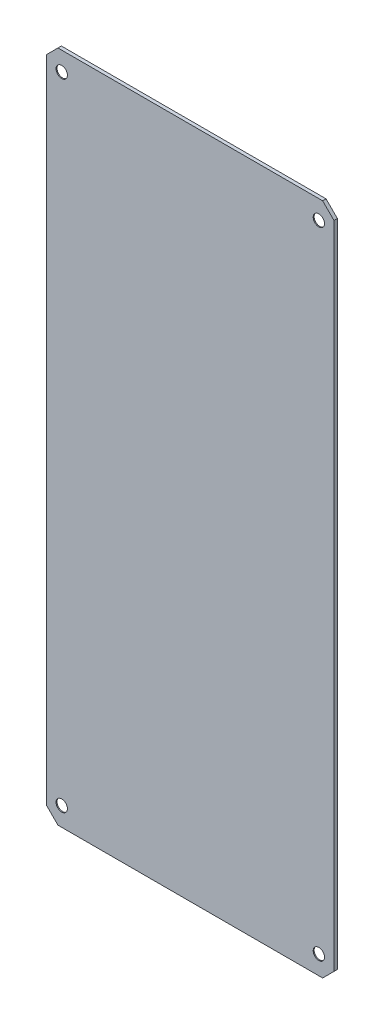
ISO-10303-21;
HEADER;
FILE_DESCRIPTION(('STEP AP214'),'2;1');
FILE_NAME('part.step','',(''),(''),'','','');
FILE_SCHEMA(('AUTOMOTIVE_DESIGN { 1 0 10303 214 1 1 1 1 }'));
ENDSEC;
DATA;
#1=APPLICATION_CONTEXT('core data for automotive mechanical design processes');
#2=APPLICATION_PROTOCOL_DEFINITION('international standard','automotive_design',2000,#1);
#3=PRODUCT_CONTEXT('',#1,'mechanical');
#4=PRODUCT('Part','Part','',(#3));
#5=PRODUCT_RELATED_PRODUCT_CATEGORY('part','',(#4));
#6=PRODUCT_DEFINITION_FORMATION('','',#4);
#7=PRODUCT_DEFINITION_CONTEXT('part definition',#1,'design');
#8=PRODUCT_DEFINITION('design','',#6,#7);
#9=PRODUCT_DEFINITION_SHAPE('','',#8);
#10=(LENGTH_UNIT() NAMED_UNIT(*) SI_UNIT(.MILLI.,.METRE.));
#11=(NAMED_UNIT(*) PLANE_ANGLE_UNIT() SI_UNIT($,.RADIAN.));
#12=(NAMED_UNIT(*) SI_UNIT($,.STERADIAN.) SOLID_ANGLE_UNIT());
#13=UNCERTAINTY_MEASURE_WITH_UNIT(LENGTH_MEASURE(1.E-05),#10,'distance_accuracy_value','');
#14=(GEOMETRIC_REPRESENTATION_CONTEXT(3) GLOBAL_UNCERTAINTY_ASSIGNED_CONTEXT((#13)) GLOBAL_UNIT_ASSIGNED_CONTEXT((#10,
#11,#12)) REPRESENTATION_CONTEXT('',''));
#15=CARTESIAN_POINT('',(0.,0.,0.));
#16=DIRECTION('',(0.,0.,1.));
#17=DIRECTION('',(1.,0.,0.));
#18=AXIS2_PLACEMENT_3D('',#15,#16,#17);
#19=CARTESIAN_POINT('',(4.,173.,-1.1));
#20=DIRECTION('',(0.,0.,1.));
#21=DIRECTION('',(1.,0.,0.));
#22=AXIS2_PLACEMENT_3D('',#19,#20,#21);
#23=CYLINDRICAL_SURFACE('',#22,2.66700000000001);
#24=CARTESIAN_POINT('',(4.,173.,0.));
#25=DIRECTION('',(0.,0.,1.));
#26=DIRECTION('',(1.,0.,0.));
#27=AXIS2_PLACEMENT_3D('',#24,#25,#26);
#28=CIRCLE('',#27,2.66700000000001);
#29=CARTESIAN_POINT('',(6.66700000000002,173.,0.));
#30=VERTEX_POINT('',#29);
#31=EDGE_CURVE('E148',#30,#30,#28,.T.);
#32=ORIENTED_EDGE('',*,*,#31,.F.);
#33=EDGE_LOOP('',(#32));
#34=FACE_BOUND('',#33,.T.);
#35=CARTESIAN_POINT('',(4.,173.,0.646));
#36=DIRECTION('',(0.,0.,1.));
#37=DIRECTION('',(1.,0.,0.));
#38=AXIS2_PLACEMENT_3D('',#35,#36,#37);
#39=CIRCLE('',#38,2.66700000000001);
#40=CARTESIAN_POINT('',(6.66700000000002,173.,0.646));
#41=VERTEX_POINT('',#40);
#42=EDGE_CURVE('E163',#41,#41,#39,.F.);
#43=ORIENTED_EDGE('',*,*,#42,.F.);
#44=EDGE_LOOP('',(#43));
#45=FACE_BOUND('',#44,.T.);
#46=ADVANCED_FACE('F43',(#34,#45),#23,.F.);
#47=CARTESIAN_POINT('',(72.,4.99999999999998,-1.1));
#48=DIRECTION('',(0.,0.,1.));
#49=DIRECTION('',(1.,0.,0.));
#50=AXIS2_PLACEMENT_3D('',#47,#48,#49);
#51=CYLINDRICAL_SURFACE('',#50,2.66700000000003);
#52=CARTESIAN_POINT('',(72.,4.99999999999998,0.));
#53=DIRECTION('',(0.,0.,1.));
#54=DIRECTION('',(1.,0.,0.));
#55=AXIS2_PLACEMENT_3D('',#52,#53,#54);
#56=CIRCLE('',#55,2.66700000000003);
#57=CARTESIAN_POINT('',(74.667,4.99999999999998,0.));
#58=VERTEX_POINT('',#57);
#59=EDGE_CURVE('E155',#58,#58,#56,.T.);
#60=ORIENTED_EDGE('',*,*,#59,.F.);
#61=EDGE_LOOP('',(#60));
#62=FACE_BOUND('',#61,.T.);
#63=CARTESIAN_POINT('',(72.,4.99999999999998,0.646));
#64=DIRECTION('',(0.,0.,1.));
#65=DIRECTION('',(1.,0.,0.));
#66=AXIS2_PLACEMENT_3D('',#63,#64,#65);
#67=CIRCLE('',#66,2.66700000000003);
#68=CARTESIAN_POINT('',(74.667,4.99999999999998,0.646));
#69=VERTEX_POINT('',#68);
#70=EDGE_CURVE('E160',#69,#69,#67,.F.);
#71=ORIENTED_EDGE('',*,*,#70,.F.);
#72=EDGE_LOOP('',(#71));
#73=FACE_BOUND('',#72,.T.);
#74=ADVANCED_FACE('F263',(#62,#73),#51,.F.);
#75=CARTESIAN_POINT('',(0.,178.,0.9));
#76=DIRECTION('',(1.,0.,0.));
#77=DIRECTION('',(0.,1.,0.));
#78=AXIS2_PLACEMENT_3D('',#75,#76,#77);
#79=PLANE('',#78);
#80=DIRECTION('',(0.,-1.,0.));
#81=VECTOR('',#80,1.);
#82=CARTESIAN_POINT('',(0.,178.,0.));
#83=LINE('',#82,#81);
#84=CARTESIAN_POINT('',(0.,175.,0.));
#85=VERTEX_POINT('',#84);
#86=CARTESIAN_POINT('',(0.,3.,0.));
#87=VERTEX_POINT('',#86);
#88=EDGE_CURVE('E137',#85,#87,#83,.T.);
#89=ORIENTED_EDGE('',*,*,#88,.T.);
#90=DIRECTION('',(0.,0.,1.));
#91=VECTOR('',#90,1.);
#92=CARTESIAN_POINT('',(0.,3.,0.9));
#93=LINE('',#92,#91);
#94=CARTESIAN_POINT('',(0.,3.,0.9));
#95=VERTEX_POINT('',#94);
#96=EDGE_CURVE('E115',#87,#95,#93,.T.);
#97=ORIENTED_EDGE('',*,*,#96,.T.);
#98=DIRECTION('',(0.,-1.,0.));
#99=VECTOR('',#98,1.);
#100=CARTESIAN_POINT('',(0.,178.,0.9));
#101=LINE('',#100,#99);
#102=CARTESIAN_POINT('',(0.,175.,0.9));
#103=VERTEX_POINT('',#102);
#104=EDGE_CURVE('E147',#103,#95,#101,.T.);
#105=ORIENTED_EDGE('',*,*,#104,.F.);
#106=DIRECTION('',(0.,0.,-1.));
#107=VECTOR('',#106,1.);
#108=CARTESIAN_POINT('',(0.,175.,0.9));
#109=LINE('',#108,#107);
#110=EDGE_CURVE('E120',#103,#85,#109,.T.);
#111=ORIENTED_EDGE('',*,*,#110,.T.);
#112=EDGE_LOOP('',(#89,#97,#105,#111));
#113=FACE_BOUND('',#112,.T.);
#114=ADVANCED_FACE('F269',(#113),#79,.F.);
#115=CARTESIAN_POINT('',(0.,0.,0.9));
#116=DIRECTION('',(0.,1.,0.));
#117=DIRECTION('',(-1.,0.,0.));
#118=AXIS2_PLACEMENT_3D('',#115,#116,#117);
#119=PLANE('',#118);
#120=DIRECTION('',(1.,0.,0.));
#121=VECTOR('',#120,1.);
#122=CARTESIAN_POINT('',(0.,0.,0.9));
#123=LINE('',#122,#121);
#124=CARTESIAN_POINT('',(2.99999999999997,0.,0.9));
#125=VERTEX_POINT('',#124);
#126=CARTESIAN_POINT('',(73.,0.,0.9));
#127=VERTEX_POINT('',#126);
#128=EDGE_CURVE('E130',#125,#127,#123,.T.);
#129=ORIENTED_EDGE('',*,*,#128,.F.);
#130=DIRECTION('',(0.,0.,-1.));
#131=VECTOR('',#130,1.);
#132=CARTESIAN_POINT('',(2.99999999999997,0.,0.9));
#133=LINE('',#132,#131);
#134=CARTESIAN_POINT('',(2.99999999999997,0.,0.));
#135=VERTEX_POINT('',#134);
#136=EDGE_CURVE('E114',#125,#135,#133,.T.);
#137=ORIENTED_EDGE('',*,*,#136,.T.);
#138=DIRECTION('',(1.,0.,0.));
#139=VECTOR('',#138,1.);
#140=CARTESIAN_POINT('',(0.,0.,0.));
#141=LINE('',#140,#139);
#142=CARTESIAN_POINT('',(73.,0.,0.));
#143=VERTEX_POINT('',#142);
#144=EDGE_CURVE('E127',#135,#143,#141,.T.);
#145=ORIENTED_EDGE('',*,*,#144,.T.);
#146=DIRECTION('',(0.,0.,1.));
#147=VECTOR('',#146,1.);
#148=CARTESIAN_POINT('',(73.,0.,0.9));
#149=LINE('',#148,#147);
#150=EDGE_CURVE('E132',#143,#127,#149,.T.);
#151=ORIENTED_EDGE('',*,*,#150,.T.);
#152=EDGE_LOOP('',(#129,#137,#145,#151));
#153=FACE_BOUND('',#152,.T.);
#154=ADVANCED_FACE('F126',(#153),#119,.F.);
#155=CARTESIAN_POINT('',(76.,178.,0.9));
#156=DIRECTION('',(-1.,0.,0.));
#157=DIRECTION('',(0.,-1.,0.));
#158=AXIS2_PLACEMENT_3D('',#155,#156,#157);
#159=PLANE('',#158);
#160=DIRECTION('',(0.,1.,0.));
#161=VECTOR('',#160,1.);
#162=CARTESIAN_POINT('',(76.,178.,0.9));
#163=LINE('',#162,#161);
#164=CARTESIAN_POINT('',(76.,3.00000000000003,0.9));
#165=VERTEX_POINT('',#164);
#166=CARTESIAN_POINT('',(76.,175.,0.9));
#167=VERTEX_POINT('',#166);
#168=EDGE_CURVE('E191',#165,#167,#163,.T.);
#169=ORIENTED_EDGE('',*,*,#168,.F.);
#170=DIRECTION('',(0.,0.,-1.));
#171=VECTOR('',#170,1.);
#172=CARTESIAN_POINT('',(76.,3.00000000000003,0.9));
#173=LINE('',#172,#171);
#174=CARTESIAN_POINT('',(76.,3.00000000000003,0.));
#175=VERTEX_POINT('',#174);
#176=EDGE_CURVE('E184',#165,#175,#173,.T.);
#177=ORIENTED_EDGE('',*,*,#176,.T.);
#178=DIRECTION('',(0.,1.,0.));
#179=VECTOR('',#178,1.);
#180=CARTESIAN_POINT('',(76.,178.,0.));
#181=LINE('',#180,#179);
#182=CARTESIAN_POINT('',(76.,175.,0.));
#183=VERTEX_POINT('',#182);
#184=EDGE_CURVE('E136',#175,#183,#181,.T.);
#185=ORIENTED_EDGE('',*,*,#184,.T.);
#186=DIRECTION('',(0.,0.,1.));
#187=VECTOR('',#186,1.);
#188=CARTESIAN_POINT('',(76.,175.,0.9));
#189=LINE('',#188,#187);
#190=EDGE_CURVE('E182',#183,#167,#189,.T.);
#191=ORIENTED_EDGE('',*,*,#190,.T.);
#192=EDGE_LOOP('',(#169,#177,#185,#191));
#193=FACE_BOUND('',#192,.T.);
#194=ADVANCED_FACE('F189',(#193),#159,.F.);
#195=CARTESIAN_POINT('',(0.,178.,0.9));
#196=DIRECTION('',(0.,-1.,0.));
#197=DIRECTION('',(0.,0.,-1.));
#198=AXIS2_PLACEMENT_3D('',#195,#196,#197);
#199=PLANE('',#198);
#200=DIRECTION('',(-1.,0.,0.));
#201=VECTOR('',#200,1.);
#202=CARTESIAN_POINT('',(0.,178.,0.9));
#203=LINE('',#202,#201);
#204=CARTESIAN_POINT('',(73.,178.,0.9));
#205=VERTEX_POINT('',#204);
#206=CARTESIAN_POINT('',(3.00000000000001,178.,0.9));
#207=VERTEX_POINT('',#206);
#208=EDGE_CURVE('E164',#205,#207,#203,.T.);
#209=ORIENTED_EDGE('',*,*,#208,.F.);
#210=DIRECTION('',(0.,0.,-1.));
#211=VECTOR('',#210,1.);
#212=CARTESIAN_POINT('',(73.,178.,0.9));
#213=LINE('',#212,#211);
#214=CARTESIAN_POINT('',(73.,178.,0.));
#215=VERTEX_POINT('',#214);
#216=EDGE_CURVE('E11',#205,#215,#213,.T.);
#217=ORIENTED_EDGE('',*,*,#216,.T.);
#218=DIRECTION('',(-1.,0.,0.));
#219=VECTOR('',#218,1.);
#220=CARTESIAN_POINT('',(0.,178.,0.));
#221=LINE('',#220,#219);
#222=CARTESIAN_POINT('',(3.00000000000001,178.,0.));
#223=VERTEX_POINT('',#222);
#224=EDGE_CURVE('E140',#215,#223,#221,.T.);
#225=ORIENTED_EDGE('',*,*,#224,.T.);
#226=DIRECTION('',(0.,0.,1.));
#227=VECTOR('',#226,1.);
#228=CARTESIAN_POINT('',(3.00000000000001,178.,0.9));
#229=LINE('',#228,#227);
#230=EDGE_CURVE('E52',#223,#207,#229,.T.);
#231=ORIENTED_EDGE('',*,*,#230,.T.);
#232=EDGE_LOOP('',(#209,#217,#225,#231));
#233=FACE_BOUND('',#232,.T.);
#234=ADVANCED_FACE('F198',(#233),#199,.F.);
#235=CARTESIAN_POINT('',(0.,0.,0.9));
#236=DIRECTION('',(0.,0.,1.));
#237=DIRECTION('',(1.,0.,0.));
#238=AXIS2_PLACEMENT_3D('',#235,#236,#237);
#239=PLANE('',#238);
#240=ORIENTED_EDGE('',*,*,#104,.T.);
#241=DIRECTION('',(-0.707106781186548,0.707106781186548,0.));
#242=VECTOR('',#241,1.);
#243=CARTESIAN_POINT('',(1.49999999999998,1.49999999999998,0.9));
#244=LINE('',#243,#242);
#245=EDGE_CURVE('E180',#95,#125,#244,.F.);
#246=ORIENTED_EDGE('',*,*,#245,.T.);
#247=ORIENTED_EDGE('',*,*,#128,.T.);
#248=DIRECTION('',(-0.707106781186549,-0.707106781186546,0.));
#249=VECTOR('',#248,1.);
#250=CARTESIAN_POINT('',(36.4999999999999,-36.5,0.9));
#251=LINE('',#250,#249);
#252=EDGE_CURVE('E178',#127,#165,#251,.F.);
#253=ORIENTED_EDGE('',*,*,#252,.T.);
#254=ORIENTED_EDGE('',*,*,#168,.T.);
#255=DIRECTION('',(0.707106781186544,-0.707106781186551,0.));
#256=VECTOR('',#255,1.);
#257=CARTESIAN_POINT('',(125.5,125.499999999999,0.9));
#258=LINE('',#257,#256);
#259=EDGE_CURVE('E65',#167,#205,#258,.F.);
#260=ORIENTED_EDGE('',*,*,#259,.T.);
#261=ORIENTED_EDGE('',*,*,#208,.T.);
#262=DIRECTION('',(0.707106781186548,0.707106781186548,0.));
#263=VECTOR('',#262,1.);
#264=CARTESIAN_POINT('',(-87.5,87.5,0.9));
#265=LINE('',#264,#263);
#266=EDGE_CURVE('E175',#207,#103,#265,.F.);
#267=ORIENTED_EDGE('',*,*,#266,.T.);
#268=EDGE_LOOP('',(#240,#246,#247,#253,#254,#260,#261,#267));
#269=FACE_BOUND('',#268,.T.);
#270=CARTESIAN_POINT('',(4.,4.99999999999998,0.9));
#271=DIRECTION('',(0.,0.,1.));
#272=DIRECTION('',(-1.,0.,0.));
#273=AXIS2_PLACEMENT_3D('',#270,#271,#272);
#274=CIRCLE('',#273,1.5);
#275=CARTESIAN_POINT('',(2.5,4.99999999999998,0.9));
#276=VERTEX_POINT('',#275);
#277=EDGE_CURVE('E214',#276,#276,#274,.T.);
#278=ORIENTED_EDGE('',*,*,#277,.F.);
#279=EDGE_LOOP('',(#278));
#280=FACE_BOUND('',#279,.T.);
#281=CARTESIAN_POINT('',(72.,4.99999999999999,0.9));
#282=DIRECTION('',(0.,0.,1.));
#283=DIRECTION('',(1.,0.,0.));
#284=AXIS2_PLACEMENT_3D('',#281,#282,#283);
#285=CIRCLE('',#284,1.5);
#286=CARTESIAN_POINT('',(73.5,4.99999999999999,0.9));
#287=VERTEX_POINT('',#286);
#288=EDGE_CURVE('E208',#287,#287,#285,.T.);
#289=ORIENTED_EDGE('',*,*,#288,.F.);
#290=EDGE_LOOP('',(#289));
#291=FACE_BOUND('',#290,.T.);
#292=CARTESIAN_POINT('',(72.,173.,0.9));
#293=DIRECTION('',(0.,0.,1.));
#294=DIRECTION('',(-1.,0.,0.));
#295=AXIS2_PLACEMENT_3D('',#292,#293,#294);
#296=CIRCLE('',#295,1.5);
#297=CARTESIAN_POINT('',(70.5,173.,0.9));
#298=VERTEX_POINT('',#297);
#299=EDGE_CURVE('E224',#298,#298,#296,.T.);
#300=ORIENTED_EDGE('',*,*,#299,.F.);
#301=EDGE_LOOP('',(#300));
#302=FACE_BOUND('',#301,.T.);
#303=CARTESIAN_POINT('',(4.,173.,0.9));
#304=DIRECTION('',(0.,0.,1.));
#305=DIRECTION('',(1.,0.,0.));
#306=AXIS2_PLACEMENT_3D('',#303,#304,#305);
#307=CIRCLE('',#306,1.5);
#308=CARTESIAN_POINT('',(5.5,173.,0.9));
#309=VERTEX_POINT('',#308);
#310=EDGE_CURVE('E205',#309,#309,#307,.T.);
#311=ORIENTED_EDGE('',*,*,#310,.F.);
#312=EDGE_LOOP('',(#311));
#313=FACE_BOUND('',#312,.T.);
#314=ADVANCED_FACE('F237',(#269,#280,#291,#302,#313),#239,.T.);
#315=CARTESIAN_POINT('',(0.,0.,0.));
#316=DIRECTION('',(0.,0.,1.));
#317=DIRECTION('',(1.,0.,0.));
#318=AXIS2_PLACEMENT_3D('',#315,#316,#317);
#319=PLANE('',#318);
#320=CARTESIAN_POINT('',(4.,4.99999999999998,0.));
#321=DIRECTION('',(0.,0.,1.));
#322=DIRECTION('',(1.,0.,0.));
#323=AXIS2_PLACEMENT_3D('',#320,#321,#322);
#324=CIRCLE('',#323,2.66700000000001);
#325=CARTESIAN_POINT('',(6.66700000000001,4.99999999999998,0.));
#326=VERTEX_POINT('',#325);
#327=EDGE_CURVE('E142',#326,#326,#324,.T.);
#328=ORIENTED_EDGE('',*,*,#327,.T.);
#329=EDGE_LOOP('',(#328));
#330=FACE_BOUND('',#329,.T.);
#331=ORIENTED_EDGE('',*,*,#59,.T.);
#332=EDGE_LOOP('',(#331));
#333=FACE_BOUND('',#332,.T.);
#334=CARTESIAN_POINT('',(72.,173.,0.));
#335=DIRECTION('',(0.,0.,1.));
#336=DIRECTION('',(1.,0.,0.));
#337=AXIS2_PLACEMENT_3D('',#334,#335,#336);
#338=CIRCLE('',#337,2.66700000000002);
#339=CARTESIAN_POINT('',(74.667,173.,0.));
#340=VERTEX_POINT('',#339);
#341=EDGE_CURVE('E151',#340,#340,#338,.T.);
#342=ORIENTED_EDGE('',*,*,#341,.T.);
#343=EDGE_LOOP('',(#342));
#344=FACE_BOUND('',#343,.T.);
#345=ORIENTED_EDGE('',*,*,#31,.T.);
#346=EDGE_LOOP('',(#345));
#347=FACE_BOUND('',#346,.T.);
#348=ORIENTED_EDGE('',*,*,#144,.F.);
#349=DIRECTION('',(0.707106781186548,-0.707106781186548,0.));
#350=VECTOR('',#349,1.);
#351=CARTESIAN_POINT('',(2.99999999999997,0.,0.));
#352=LINE('',#351,#350);
#353=EDGE_CURVE('E110',#135,#87,#352,.F.);
#354=ORIENTED_EDGE('',*,*,#353,.T.);
#355=ORIENTED_EDGE('',*,*,#88,.F.);
#356=DIRECTION('',(-0.707106781186548,-0.707106781186548,0.));
#357=VECTOR('',#356,1.);
#358=CARTESIAN_POINT('',(0.,175.,0.));
#359=LINE('',#358,#357);
#360=EDGE_CURVE('E131',#85,#223,#359,.F.);
#361=ORIENTED_EDGE('',*,*,#360,.T.);
#362=ORIENTED_EDGE('',*,*,#224,.F.);
#363=DIRECTION('',(-0.707106781186544,0.707106781186551,0.));
#364=VECTOR('',#363,1.);
#365=CARTESIAN_POINT('',(73.,178.,0.));
#366=LINE('',#365,#364);
#367=EDGE_CURVE('E169',#215,#183,#366,.F.);
#368=ORIENTED_EDGE('',*,*,#367,.T.);
#369=ORIENTED_EDGE('',*,*,#184,.F.);
#370=DIRECTION('',(0.707106781186549,0.707106781186546,0.));
#371=VECTOR('',#370,1.);
#372=CARTESIAN_POINT('',(76.,3.00000000000003,0.));
#373=LINE('',#372,#371);
#374=EDGE_CURVE('E121',#175,#143,#373,.F.);
#375=ORIENTED_EDGE('',*,*,#374,.T.);
#376=EDGE_LOOP('',(#348,#354,#355,#361,#362,#368,#369,#375));
#377=FACE_BOUND('',#376,.T.);
#378=ADVANCED_FACE('F134',(#330,#333,#344,#347,#377),#319,.F.);
#379=CARTESIAN_POINT('',(72.,173.,-1.1));
#380=DIRECTION('',(0.,0.,1.));
#381=DIRECTION('',(1.,0.,0.));
#382=AXIS2_PLACEMENT_3D('',#379,#380,#381);
#383=CYLINDRICAL_SURFACE('',#382,2.66700000000002);
#384=CARTESIAN_POINT('',(72.,173.,0.646));
#385=DIRECTION('',(0.,0.,1.));
#386=DIRECTION('',(-1.,0.,0.));
#387=AXIS2_PLACEMENT_3D('',#384,#385,#386);
#388=CIRCLE('',#387,2.66700000000001);
#389=CARTESIAN_POINT('',(69.333,173.,0.646));
#390=VERTEX_POINT('',#389);
#391=EDGE_CURVE('E218',#390,#390,#388,.T.);
#392=ORIENTED_EDGE('',*,*,#391,.T.);
#393=EDGE_LOOP('',(#392));
#394=FACE_BOUND('',#393,.T.);
#395=ORIENTED_EDGE('',*,*,#341,.F.);
#396=EDGE_LOOP('',(#395));
#397=FACE_BOUND('',#396,.T.);
#398=ADVANCED_FACE('F279',(#394,#397),#383,.F.);
#399=CARTESIAN_POINT('',(4.,4.99999999999998,-1.1));
#400=DIRECTION('',(0.,0.,1.));
#401=DIRECTION('',(1.,0.,0.));
#402=AXIS2_PLACEMENT_3D('',#399,#400,#401);
#403=CYLINDRICAL_SURFACE('',#402,2.66700000000001);
#404=CARTESIAN_POINT('',(4.,4.99999999999998,0.646));
#405=DIRECTION('',(0.,0.,1.));
#406=DIRECTION('',(-1.,0.,0.));
#407=AXIS2_PLACEMENT_3D('',#404,#405,#406);
#408=CIRCLE('',#407,2.66700000000001);
#409=CARTESIAN_POINT('',(1.333,4.99999999999998,0.646));
#410=VERTEX_POINT('',#409);
#411=EDGE_CURVE('E215',#410,#410,#408,.T.);
#412=ORIENTED_EDGE('',*,*,#411,.T.);
#413=EDGE_LOOP('',(#412));
#414=FACE_BOUND('',#413,.T.);
#415=ORIENTED_EDGE('',*,*,#327,.F.);
#416=EDGE_LOOP('',(#415));
#417=FACE_BOUND('',#416,.T.);
#418=ADVANCED_FACE('F275',(#414,#417),#403,.F.);
#419=CARTESIAN_POINT('',(4.,4.99999999999998,0.646));
#420=DIRECTION('',(0.,0.,-1.));
#421=DIRECTION('',(-1.,0.,0.));
#422=AXIS2_PLACEMENT_3D('',#419,#420,#421);
#423=PLANE('',#422);
#424=CARTESIAN_POINT('',(4.,4.99999999999998,0.646));
#425=DIRECTION('',(0.,0.,1.));
#426=DIRECTION('',(-1.,0.,0.));
#427=AXIS2_PLACEMENT_3D('',#424,#425,#426);
#428=CIRCLE('',#427,1.5);
#429=CARTESIAN_POINT('',(2.5,4.99999999999998,0.646));
#430=VERTEX_POINT('',#429);
#431=EDGE_CURVE('E211',#430,#430,#428,.T.);
#432=ORIENTED_EDGE('',*,*,#431,.T.);
#433=EDGE_LOOP('',(#432));
#434=FACE_BOUND('',#433,.T.);
#435=ORIENTED_EDGE('',*,*,#411,.F.);
#436=EDGE_LOOP('',(#435));
#437=FACE_BOUND('',#436,.T.);
#438=ADVANCED_FACE('F314',(#434,#437),#423,.T.);
#439=CARTESIAN_POINT('',(4.,4.99999999999998,0.646));
#440=DIRECTION('',(0.,0.,1.));
#441=DIRECTION('',(1.,0.,0.));
#442=AXIS2_PLACEMENT_3D('',#439,#440,#441);
#443=CYLINDRICAL_SURFACE('',#442,1.5);
#444=ORIENTED_EDGE('',*,*,#431,.F.);
#445=EDGE_LOOP('',(#444));
#446=FACE_BOUND('',#445,.T.);
#447=ORIENTED_EDGE('',*,*,#277,.T.);
#448=EDGE_LOOP('',(#447));
#449=FACE_BOUND('',#448,.T.);
#450=ADVANCED_FACE('F311',(#446,#449),#443,.F.);
#451=CARTESIAN_POINT('',(72.,4.99999999999999,0.646));
#452=DIRECTION('',(0.,0.,1.));
#453=DIRECTION('',(1.,0.,0.));
#454=AXIS2_PLACEMENT_3D('',#451,#452,#453);
#455=PLANE('',#454);
#456=CARTESIAN_POINT('',(72.,4.99999999999999,0.646));
#457=DIRECTION('',(0.,0.,1.));
#458=DIRECTION('',(1.,0.,0.));
#459=AXIS2_PLACEMENT_3D('',#456,#457,#458);
#460=CIRCLE('',#459,1.5);
#461=CARTESIAN_POINT('',(73.5,4.99999999999999,0.646));
#462=VERTEX_POINT('',#461);
#463=EDGE_CURVE('E227',#462,#462,#460,.T.);
#464=ORIENTED_EDGE('',*,*,#463,.T.);
#465=EDGE_LOOP('',(#464));
#466=FACE_BOUND('',#465,.T.);
#467=ORIENTED_EDGE('',*,*,#70,.T.);
#468=EDGE_LOOP('',(#467));
#469=FACE_BOUND('',#468,.T.);
#470=ADVANCED_FACE('F313',(#466,#469),#455,.F.);
#471=CARTESIAN_POINT('',(72.,4.99999999999999,0.646));
#472=DIRECTION('',(0.,0.,1.));
#473=DIRECTION('',(1.,0.,0.));
#474=AXIS2_PLACEMENT_3D('',#471,#472,#473);
#475=CYLINDRICAL_SURFACE('',#474,1.5);
#476=ORIENTED_EDGE('',*,*,#463,.F.);
#477=EDGE_LOOP('',(#476));
#478=FACE_BOUND('',#477,.T.);
#479=ORIENTED_EDGE('',*,*,#288,.T.);
#480=EDGE_LOOP('',(#479));
#481=FACE_BOUND('',#480,.T.);
#482=ADVANCED_FACE('F235',(#478,#481),#475,.F.);
#483=CARTESIAN_POINT('',(72.,173.,0.646));
#484=DIRECTION('',(0.,0.,-1.));
#485=DIRECTION('',(-1.,0.,0.));
#486=AXIS2_PLACEMENT_3D('',#483,#484,#485);
#487=PLANE('',#486);
#488=CARTESIAN_POINT('',(72.,173.,0.646));
#489=DIRECTION('',(0.,0.,1.));
#490=DIRECTION('',(-1.,0.,0.));
#491=AXIS2_PLACEMENT_3D('',#488,#489,#490);
#492=CIRCLE('',#491,1.5);
#493=CARTESIAN_POINT('',(70.5,173.,0.646));
#494=VERTEX_POINT('',#493);
#495=EDGE_CURVE('E221',#494,#494,#492,.T.);
#496=ORIENTED_EDGE('',*,*,#495,.T.);
#497=EDGE_LOOP('',(#496));
#498=FACE_BOUND('',#497,.T.);
#499=ORIENTED_EDGE('',*,*,#391,.F.);
#500=EDGE_LOOP('',(#499));
#501=FACE_BOUND('',#500,.T.);
#502=ADVANCED_FACE('F328',(#498,#501),#487,.T.);
#503=CARTESIAN_POINT('',(72.,173.,0.646));
#504=DIRECTION('',(0.,0.,1.));
#505=DIRECTION('',(1.,0.,0.));
#506=AXIS2_PLACEMENT_3D('',#503,#504,#505);
#507=CYLINDRICAL_SURFACE('',#506,1.5);
#508=ORIENTED_EDGE('',*,*,#495,.F.);
#509=EDGE_LOOP('',(#508));
#510=FACE_BOUND('',#509,.T.);
#511=ORIENTED_EDGE('',*,*,#299,.T.);
#512=EDGE_LOOP('',(#511));
#513=FACE_BOUND('',#512,.T.);
#514=ADVANCED_FACE('F257',(#510,#513),#507,.F.);
#515=CARTESIAN_POINT('',(4.,173.,0.646));
#516=DIRECTION('',(0.,0.,1.));
#517=DIRECTION('',(1.,0.,0.));
#518=AXIS2_PLACEMENT_3D('',#515,#516,#517);
#519=PLANE('',#518);
#520=CARTESIAN_POINT('',(4.,173.,0.646));
#521=DIRECTION('',(0.,0.,1.));
#522=DIRECTION('',(1.,0.,0.));
#523=AXIS2_PLACEMENT_3D('',#520,#521,#522);
#524=CIRCLE('',#523,1.5);
#525=CARTESIAN_POINT('',(5.5,173.,0.646));
#526=VERTEX_POINT('',#525);
#527=EDGE_CURVE('E152',#526,#526,#524,.T.);
#528=ORIENTED_EDGE('',*,*,#527,.T.);
#529=EDGE_LOOP('',(#528));
#530=FACE_BOUND('',#529,.T.);
#531=ORIENTED_EDGE('',*,*,#42,.T.);
#532=EDGE_LOOP('',(#531));
#533=FACE_BOUND('',#532,.T.);
#534=ADVANCED_FACE('F247',(#530,#533),#519,.F.);
#535=CARTESIAN_POINT('',(4.,173.,0.646));
#536=DIRECTION('',(0.,0.,1.));
#537=DIRECTION('',(1.,0.,0.));
#538=AXIS2_PLACEMENT_3D('',#535,#536,#537);
#539=CYLINDRICAL_SURFACE('',#538,1.5);
#540=ORIENTED_EDGE('',*,*,#527,.F.);
#541=EDGE_LOOP('',(#540));
#542=FACE_BOUND('',#541,.T.);
#543=ORIENTED_EDGE('',*,*,#310,.T.);
#544=EDGE_LOOP('',(#543));
#545=FACE_BOUND('',#544,.T.);
#546=ADVANCED_FACE('F245',(#542,#545),#539,.F.);
#547=CARTESIAN_POINT('',(2.99999999999997,0.,0.9));
#548=DIRECTION('',(0.707106781186547,0.707106781186547,0.));
#549=DIRECTION('',(0.,0.,-1.));
#550=AXIS2_PLACEMENT_3D('',#547,#548,#549);
#551=PLANE('',#550);
#552=ORIENTED_EDGE('',*,*,#245,.F.);
#553=ORIENTED_EDGE('',*,*,#96,.F.);
#554=ORIENTED_EDGE('',*,*,#353,.F.);
#555=ORIENTED_EDGE('',*,*,#136,.F.);
#556=EDGE_LOOP('',(#552,#553,#554,#555));
#557=FACE_BOUND('',#556,.T.);
#558=ADVANCED_FACE('F113',(#557),#551,.F.);
#559=CARTESIAN_POINT('',(76.,3.00000000000003,0.9));
#560=DIRECTION('',(-0.707106781186546,0.707106781186549,0.));
#561=DIRECTION('',(0.,0.,-1.));
#562=AXIS2_PLACEMENT_3D('',#559,#560,#561);
#563=PLANE('',#562);
#564=ORIENTED_EDGE('',*,*,#252,.F.);
#565=ORIENTED_EDGE('',*,*,#150,.F.);
#566=ORIENTED_EDGE('',*,*,#374,.F.);
#567=ORIENTED_EDGE('',*,*,#176,.F.);
#568=EDGE_LOOP('',(#564,#565,#566,#567));
#569=FACE_BOUND('',#568,.T.);
#570=ADVANCED_FACE('F255',(#569),#563,.F.);
#571=CARTESIAN_POINT('',(73.,178.,0.9));
#572=DIRECTION('',(-0.707106781186551,-0.707106781186544,0.));
#573=DIRECTION('',(0.,0.,-1.));
#574=AXIS2_PLACEMENT_3D('',#571,#572,#573);
#575=PLANE('',#574);
#576=ORIENTED_EDGE('',*,*,#259,.F.);
#577=ORIENTED_EDGE('',*,*,#190,.F.);
#578=ORIENTED_EDGE('',*,*,#367,.F.);
#579=ORIENTED_EDGE('',*,*,#216,.F.);
#580=EDGE_LOOP('',(#576,#577,#578,#579));
#581=FACE_BOUND('',#580,.T.);
#582=ADVANCED_FACE('F197',(#581),#575,.F.);
#583=CARTESIAN_POINT('',(0.,175.,0.9));
#584=DIRECTION('',(0.707106781186547,-0.707106781186547,0.));
#585=DIRECTION('',(0.,0.,-1.));
#586=AXIS2_PLACEMENT_3D('',#583,#584,#585);
#587=PLANE('',#586);
#588=ORIENTED_EDGE('',*,*,#266,.F.);
#589=ORIENTED_EDGE('',*,*,#230,.F.);
#590=ORIENTED_EDGE('',*,*,#360,.F.);
#591=ORIENTED_EDGE('',*,*,#110,.F.);
#592=EDGE_LOOP('',(#588,#589,#590,#591));
#593=FACE_BOUND('',#592,.T.);
#594=ADVANCED_FACE('F46',(#593),#587,.F.);
#595=CLOSED_SHELL('',(#46,#74,#114,#154,#194,#234,#314,#378,#398,#418,#438,#450,#470,#482,#502,
#514,#534,#546,#558,#570,#582,#594));
#596=MANIFOLD_SOLID_BREP('B2',#595);
#597=ADVANCED_BREP_SHAPE_REPRESENTATION('',(#18,#596),#14);
#598=SHAPE_DEFINITION_REPRESENTATION(#9,#597);
ENDSEC;
END-ISO-10303-21;
